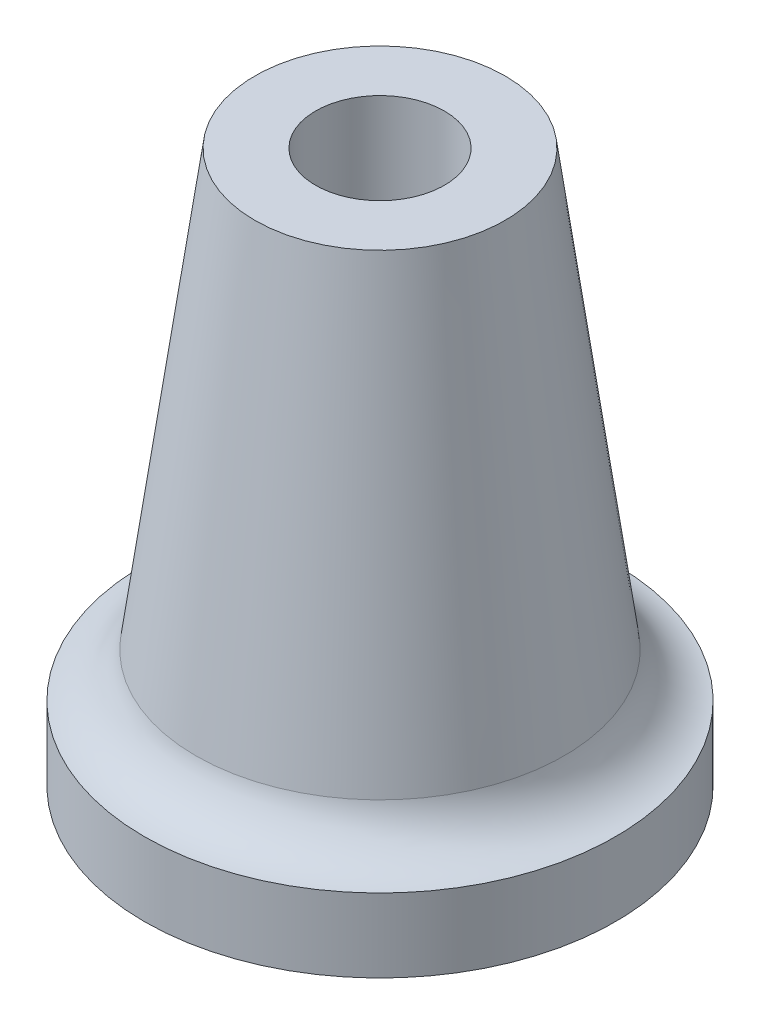
ISO-10303-21;
HEADER;
FILE_DESCRIPTION(('STEP AP214'),'2;1');
FILE_NAME('part.step','',(''),(''),'','','');
FILE_SCHEMA(('AUTOMOTIVE_DESIGN { 1 0 10303 214 1 1 1 1 }'));
ENDSEC;
DATA;
#1=APPLICATION_CONTEXT('core data for automotive mechanical design processes');
#2=APPLICATION_PROTOCOL_DEFINITION('international standard','automotive_design',2000,#1);
#3=PRODUCT_CONTEXT('',#1,'mechanical');
#4=PRODUCT('Part','Part','',(#3));
#5=PRODUCT_RELATED_PRODUCT_CATEGORY('part','',(#4));
#6=PRODUCT_DEFINITION_FORMATION('','',#4);
#7=PRODUCT_DEFINITION_CONTEXT('part definition',#1,'design');
#8=PRODUCT_DEFINITION('design','',#6,#7);
#9=PRODUCT_DEFINITION_SHAPE('','',#8);
#10=(LENGTH_UNIT() NAMED_UNIT(*) SI_UNIT(.MILLI.,.METRE.));
#11=(NAMED_UNIT(*) PLANE_ANGLE_UNIT() SI_UNIT($,.RADIAN.));
#12=(NAMED_UNIT(*) SI_UNIT($,.STERADIAN.) SOLID_ANGLE_UNIT());
#13=UNCERTAINTY_MEASURE_WITH_UNIT(LENGTH_MEASURE(1.E-05),#10,'distance_accuracy_value','');
#14=(GEOMETRIC_REPRESENTATION_CONTEXT(3) GLOBAL_UNCERTAINTY_ASSIGNED_CONTEXT((#13)) GLOBAL_UNIT_ASSIGNED_CONTEXT((#10,
#11,#12)) REPRESENTATION_CONTEXT('',''));
#15=CARTESIAN_POINT('',(0.,0.,0.));
#16=DIRECTION('',(0.,0.,1.));
#17=DIRECTION('',(1.,0.,0.));
#18=AXIS2_PLACEMENT_3D('',#15,#16,#17);
#19=CARTESIAN_POINT('',(0.,-112.379494543918,0.));
#20=DIRECTION('',(0.,-1.,0.));
#21=DIRECTION('',(0.,0.,-1.));
#22=AXIS2_PLACEMENT_3D('',#19,#20,#21);
#23=CYLINDRICAL_SURFACE('',#22,87.5);
#24=CARTESIAN_POINT('',(0.,670.978839747291,0.));
#25=DIRECTION('',(0.,-1.,0.));
#26=DIRECTION('',(0.,0.,-1.));
#27=AXIS2_PLACEMENT_3D('',#24,#25,#26);
#28=CIRCLE('',#27,87.5);
#29=CARTESIAN_POINT('',(0.,670.978839747291,-87.5));
#30=VERTEX_POINT('',#29);
#31=EDGE_CURVE('E82',#30,#30,#28,.T.);
#32=ORIENTED_EDGE('',*,*,#31,.F.);
#33=EDGE_LOOP('',(#32));
#34=FACE_BOUND('',#33,.T.);
#35=CARTESIAN_POINT('',(0.,290.978839747291,0.));
#36=DIRECTION('',(0.,-1.,0.));
#37=DIRECTION('',(0.,0.,-1.));
#38=AXIS2_PLACEMENT_3D('',#35,#36,#37);
#39=CIRCLE('',#38,87.5);
#40=CARTESIAN_POINT('',(0.,290.978839747291,-87.5));
#41=VERTEX_POINT('',#40);
#42=EDGE_CURVE('E10',#41,#41,#39,.T.);
#43=ORIENTED_EDGE('',*,*,#42,.T.);
#44=EDGE_LOOP('',(#43));
#45=FACE_BOUND('',#44,.T.);
#46=ADVANCED_FACE('F39',(#34,#45),#23,.F.);
#47=CARTESIAN_POINT('',(-1.40457133724416E-13,290.978839747291,0.));
#48=DIRECTION('',(0.,1.,0.));
#49=DIRECTION('',(0.,0.,1.));
#50=AXIS2_PLACEMENT_3D('',#47,#48,#49);
#51=PLANE('',#50);
#52=ORIENTED_EDGE('',*,*,#42,.F.);
#53=EDGE_LOOP('',(#52));
#54=FACE_BOUND('',#53,.T.);
#55=CARTESIAN_POINT('',(0.,290.978839747291,0.));
#56=DIRECTION('',(0.,-1.,0.));
#57=DIRECTION('',(0.,0.,-1.));
#58=AXIS2_PLACEMENT_3D('',#55,#56,#57);
#59=CIRCLE('',#58,115.);
#60=CARTESIAN_POINT('',(0.,290.978839747291,-115.));
#61=VERTEX_POINT('',#60);
#62=EDGE_CURVE('E46',#61,#61,#59,.T.);
#63=ORIENTED_EDGE('',*,*,#62,.T.);
#64=EDGE_LOOP('',(#63));
#65=FACE_BOUND('',#64,.T.);
#66=ADVANCED_FACE('F90',(#54,#65),#51,.F.);
#67=CARTESIAN_POINT('',(0.,-112.379494543918,0.));
#68=DIRECTION('',(0.,-1.,0.));
#69=DIRECTION('',(0.,0.,-1.));
#70=AXIS2_PLACEMENT_3D('',#67,#68,#69);
#71=CYLINDRICAL_SURFACE('',#70,115.);
#72=ORIENTED_EDGE('',*,*,#62,.F.);
#73=EDGE_LOOP('',(#72));
#74=FACE_BOUND('',#73,.T.);
#75=CARTESIAN_POINT('',(0.,-39.0211602527087,0.));
#76=DIRECTION('',(0.,-1.,0.));
#77=DIRECTION('',(0.,0.,-1.));
#78=AXIS2_PLACEMENT_3D('',#75,#76,#77);
#79=CIRCLE('',#78,115.);
#80=CARTESIAN_POINT('',(0.,-39.0211602527087,-115.));
#81=VERTEX_POINT('',#80);
#82=EDGE_CURVE('E51',#81,#81,#79,.T.);
#83=ORIENTED_EDGE('',*,*,#82,.T.);
#84=EDGE_LOOP('',(#83));
#85=FACE_BOUND('',#84,.T.);
#86=ADVANCED_FACE('F94',(#74,#85),#71,.F.);
#87=CARTESIAN_POINT('',(0.,-39.0211602527087,0.));
#88=DIRECTION('',(0.,1.,0.));
#89=DIRECTION('',(0.,0.,1.));
#90=AXIS2_PLACEMENT_3D('',#87,#88,#89);
#91=PLANE('',#90);
#92=ORIENTED_EDGE('',*,*,#82,.F.);
#93=EDGE_LOOP('',(#92));
#94=FACE_BOUND('',#93,.T.);
#95=CARTESIAN_POINT('',(0.,-39.0211602527087,0.));
#96=DIRECTION('',(0.,-1.,0.));
#97=DIRECTION('',(0.,0.,-1.));
#98=AXIS2_PLACEMENT_3D('',#95,#96,#97);
#99=CIRCLE('',#98,180.);
#100=CARTESIAN_POINT('',(0.,-39.0211602527087,-180.));
#101=VERTEX_POINT('',#100);
#102=EDGE_CURVE('E56',#101,#101,#99,.T.);
#103=ORIENTED_EDGE('',*,*,#102,.T.);
#104=EDGE_LOOP('',(#103));
#105=FACE_BOUND('',#104,.T.);
#106=ADVANCED_FACE('F99',(#94,#105),#91,.F.);
#107=CARTESIAN_POINT('',(0.,-112.379494543918,0.));
#108=DIRECTION('',(0.,-1.,0.));
#109=DIRECTION('',(0.,0.,-1.));
#110=AXIS2_PLACEMENT_3D('',#107,#108,#109);
#111=CYLINDRICAL_SURFACE('',#110,180.);
#112=ORIENTED_EDGE('',*,*,#102,.F.);
#113=EDGE_LOOP('',(#112));
#114=FACE_BOUND('',#113,.T.);
#115=CARTESIAN_POINT('',(0.,-79.0211602527087,0.));
#116=DIRECTION('',(0.,-1.,0.));
#117=DIRECTION('',(0.,0.,-1.));
#118=AXIS2_PLACEMENT_3D('',#115,#116,#117);
#119=CIRCLE('',#118,180.);
#120=CARTESIAN_POINT('',(0.,-79.0211602527087,-180.));
#121=VERTEX_POINT('',#120);
#122=EDGE_CURVE('E62',#121,#121,#119,.T.);
#123=ORIENTED_EDGE('',*,*,#122,.T.);
#124=EDGE_LOOP('',(#123));
#125=FACE_BOUND('',#124,.T.);
#126=ADVANCED_FACE('F105',(#114,#125),#111,.F.);
#127=CARTESIAN_POINT('',(0.,-79.0211602527087,0.));
#128=DIRECTION('',(0.,-1.,0.));
#129=DIRECTION('',(0.,0.,-1.));
#130=AXIS2_PLACEMENT_3D('',#127,#128,#129);
#131=PLANE('',#130);
#132=CARTESIAN_POINT('',(0.,-79.0211602527087,0.));
#133=DIRECTION('',(0.,-1.,0.));
#134=DIRECTION('',(0.,0.,-1.));
#135=AXIS2_PLACEMENT_3D('',#132,#133,#134);
#136=CIRCLE('',#135,320.);
#137=CARTESIAN_POINT('',(0.,-79.0211602527087,-320.));
#138=VERTEX_POINT('',#137);
#139=EDGE_CURVE('E66',#138,#138,#136,.T.);
#140=ORIENTED_EDGE('',*,*,#139,.T.);
#141=EDGE_LOOP('',(#140));
#142=FACE_BOUND('',#141,.T.);
#143=ORIENTED_EDGE('',*,*,#122,.F.);
#144=EDGE_LOOP('',(#143));
#145=FACE_BOUND('',#144,.T.);
#146=ADVANCED_FACE('F109',(#142,#145),#131,.T.);
#147=CARTESIAN_POINT('',(0.,-112.379494543918,0.));
#148=DIRECTION('',(0.,-1.,0.));
#149=DIRECTION('',(0.,0.,-1.));
#150=AXIS2_PLACEMENT_3D('',#147,#148,#149);
#151=CYLINDRICAL_SURFACE('',#150,320.);
#152=CARTESIAN_POINT('',(0.,20.9788397472913,0.));
#153=DIRECTION('',(0.,-1.,0.));
#154=DIRECTION('',(0.,0.,-1.));
#155=AXIS2_PLACEMENT_3D('',#152,#153,#154);
#156=CIRCLE('',#155,320.);
#157=CARTESIAN_POINT('',(0.,20.9788397472913,-320.));
#158=VERTEX_POINT('',#157);
#159=EDGE_CURVE('E70',#158,#158,#156,.T.);
#160=ORIENTED_EDGE('',*,*,#159,.T.);
#161=EDGE_LOOP('',(#160));
#162=FACE_BOUND('',#161,.T.);
#163=ORIENTED_EDGE('',*,*,#139,.F.);
#164=EDGE_LOOP('',(#163));
#165=FACE_BOUND('',#164,.T.);
#166=ADVANCED_FACE('F113',(#162,#165),#151,.T.);
#167=CARTESIAN_POINT('',(0.,100.621681776187,0.));
#168=DIRECTION('',(0.,-1.,0.));
#169=DIRECTION('',(0.,0.,-1.));
#170=AXIS2_PLACEMENT_3D('',#167,#168,#169);
#171=TOROIDAL_SURFACE('',#170,327.551007453339,80.);
#172=ORIENTED_EDGE('',*,*,#159,.F.);
#173=EDGE_LOOP('',(#172));
#174=FACE_BOUND('',#173,.T.);
#175=CARTESIAN_POINT('',(0.,80.9788397472913,0.));
#176=DIRECTION('',(0.,-1.,0.));
#177=DIRECTION('',(0.,0.,-1.));
#178=AXIS2_PLACEMENT_3D('',#175,#176,#177);
#179=CIRCLE('',#178,250.);
#180=CARTESIAN_POINT('',(0.,80.9788397472913,-250.));
#181=VERTEX_POINT('',#180);
#182=EDGE_CURVE('E74',#181,#181,#179,.T.);
#183=ORIENTED_EDGE('',*,*,#182,.T.);
#184=EDGE_LOOP('',(#183));
#185=FACE_BOUND('',#184,.T.);
#186=ADVANCED_FACE('F117',(#174,#185),#171,.F.);
#187=CARTESIAN_POINT('',(0.,670.978839747291,0.));
#188=DIRECTION('',(0.,-1.,0.));
#189=DIRECTION('',(0.,0.,-1.));
#190=AXIS2_PLACEMENT_3D('',#187,#188,#189);
#191=CONICAL_SURFACE('',#190,170.,0.134771284477731);
#192=ORIENTED_EDGE('',*,*,#182,.F.);
#193=EDGE_LOOP('',(#192));
#194=FACE_BOUND('',#193,.T.);
#195=CARTESIAN_POINT('',(0.,670.978839747291,0.));
#196=DIRECTION('',(0.,-1.,0.));
#197=DIRECTION('',(0.,0.,-1.));
#198=AXIS2_PLACEMENT_3D('',#195,#196,#197);
#199=CIRCLE('',#198,170.);
#200=CARTESIAN_POINT('',(0.,670.978839747291,-170.));
#201=VERTEX_POINT('',#200);
#202=EDGE_CURVE('E78',#201,#201,#199,.T.);
#203=ORIENTED_EDGE('',*,*,#202,.T.);
#204=EDGE_LOOP('',(#203));
#205=FACE_BOUND('',#204,.T.);
#206=ADVANCED_FACE('F121',(#194,#205),#191,.T.);
#207=CARTESIAN_POINT('',(0.,670.978839747291,0.));
#208=DIRECTION('',(0.,-1.,0.));
#209=DIRECTION('',(0.,0.,-1.));
#210=AXIS2_PLACEMENT_3D('',#207,#208,#209);
#211=PLANE('',#210);
#212=ORIENTED_EDGE('',*,*,#202,.F.);
#213=EDGE_LOOP('',(#212));
#214=FACE_BOUND('',#213,.T.);
#215=ORIENTED_EDGE('',*,*,#31,.T.);
#216=EDGE_LOOP('',(#215));
#217=FACE_BOUND('',#216,.T.);
#218=ADVANCED_FACE('F87',(#214,#217),#211,.F.);
#219=CLOSED_SHELL('',(#46,#66,#86,#106,#126,#146,#166,#186,#206,#218));
#220=MANIFOLD_SOLID_BREP('B2',#219);
#221=ADVANCED_BREP_SHAPE_REPRESENTATION('',(#18,#220),#14);
#222=SHAPE_DEFINITION_REPRESENTATION(#9,#221);
ENDSEC;
END-ISO-10303-21;
